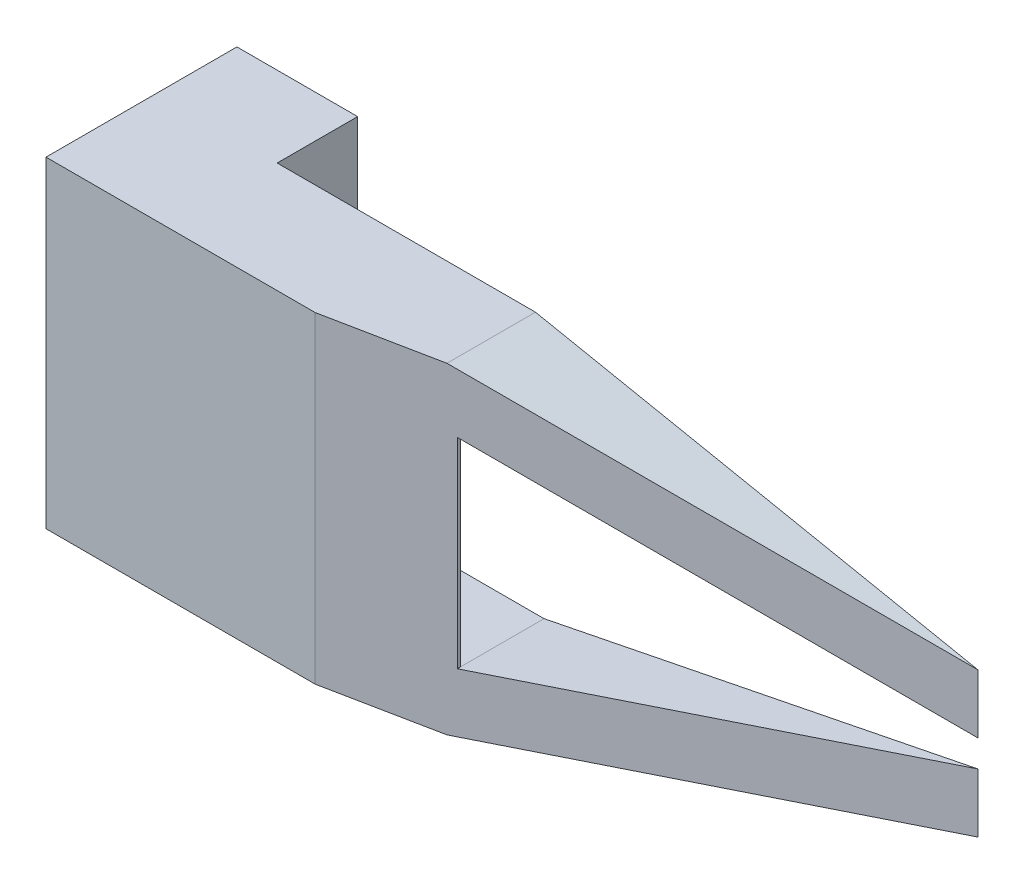
ISO-10303-21;
HEADER;
FILE_DESCRIPTION(('STEP AP214'),'2;1');
FILE_NAME('part.step','',(''),(''),'','','');
FILE_SCHEMA(('AUTOMOTIVE_DESIGN { 1 0 10303 214 1 1 1 1 }'));
ENDSEC;
DATA;
#1=APPLICATION_CONTEXT('core data for automotive mechanical design processes');
#2=APPLICATION_PROTOCOL_DEFINITION('international standard','automotive_design',2000,#1);
#3=PRODUCT_CONTEXT('',#1,'mechanical');
#4=PRODUCT('Part','Part','',(#3));
#5=PRODUCT_RELATED_PRODUCT_CATEGORY('part','',(#4));
#6=PRODUCT_DEFINITION_FORMATION('','',#4);
#7=PRODUCT_DEFINITION_CONTEXT('part definition',#1,'design');
#8=PRODUCT_DEFINITION('design','',#6,#7);
#9=PRODUCT_DEFINITION_SHAPE('','',#8);
#10=(LENGTH_UNIT() NAMED_UNIT(*) SI_UNIT(.MILLI.,.METRE.));
#11=(NAMED_UNIT(*) PLANE_ANGLE_UNIT() SI_UNIT($,.RADIAN.));
#12=(NAMED_UNIT(*) SI_UNIT($,.STERADIAN.) SOLID_ANGLE_UNIT());
#13=UNCERTAINTY_MEASURE_WITH_UNIT(LENGTH_MEASURE(1.E-05),#10,'distance_accuracy_value','');
#14=(GEOMETRIC_REPRESENTATION_CONTEXT(3) GLOBAL_UNCERTAINTY_ASSIGNED_CONTEXT((#13)) GLOBAL_UNIT_ASSIGNED_CONTEXT((#10,
#11,#12)) REPRESENTATION_CONTEXT('',''));
#15=CARTESIAN_POINT('',(0.,0.,0.));
#16=DIRECTION('',(0.,0.,1.));
#17=DIRECTION('',(1.,0.,0.));
#18=AXIS2_PLACEMENT_3D('',#15,#16,#17);
#19=CARTESIAN_POINT('',(8.78638743275149,12.,-5.88348405208144));
#20=DIRECTION('',(0.,0.,1.));
#21=DIRECTION('',(1.,0.,0.));
#22=AXIS2_PLACEMENT_3D('',#19,#20,#21);
#23=PLANE('',#22);
#24=DIRECTION('',(0.980580675688886,-0.196116135148356,0.));
#25=VECTOR('',#24,1.);
#26=CARTESIAN_POINT('',(39.4174202711404,6.5,-5.88348405208144));
#27=LINE('',#26,#25);
#28=CARTESIAN_POINT('',(23.2378391220132,9.73591623,-5.88348405208144));
#29=VERTEX_POINT('',#28);
#30=CARTESIAN_POINT('',(39.4174202711404,6.5,-5.88348405208144));
#31=VERTEX_POINT('',#30);
#32=EDGE_CURVE('E184',#29,#31,#27,.T.);
#33=ORIENTED_EDGE('',*,*,#32,.F.);
#34=DIRECTION('',(-1.,0.,0.));
#35=VECTOR('',#34,1.);
#36=CARTESIAN_POINT('',(8.78638743275149,9.73591623,-5.88348405208144));
#37=LINE('',#36,#35);
#38=CARTESIAN_POINT('',(13.28638743,9.73591623,-5.88348405208144));
#39=VERTEX_POINT('',#38);
#40=EDGE_CURVE('E281',#29,#39,#37,.T.);
#41=ORIENTED_EDGE('',*,*,#40,.T.);
#42=DIRECTION('',(0.,-1.,0.));
#43=VECTOR('',#42,1.);
#44=CARTESIAN_POINT('',(13.28638743,12.,-5.88348405208144));
#45=LINE('',#44,#43);
#46=CARTESIAN_POINT('',(13.28638743,12.,-5.88348405208144));
#47=VERTEX_POINT('',#46);
#48=EDGE_CURVE('E219',#47,#39,#45,.T.);
#49=ORIENTED_EDGE('',*,*,#48,.F.);
#50=DIRECTION('',(-1.,0.,0.));
#51=VECTOR('',#50,1.);
#52=CARTESIAN_POINT('',(8.78638743275149,12.,-5.88348405208144));
#53=LINE('',#52,#51);
#54=CARTESIAN_POINT('',(22.9174202711404,12.,-5.88348405208144));
#55=VERTEX_POINT('',#54);
#56=EDGE_CURVE('E206',#55,#47,#53,.T.);
#57=ORIENTED_EDGE('',*,*,#56,.F.);
#58=DIRECTION('',(0.980580675704681,-0.196116135069382,0.));
#59=VECTOR('',#58,1.);
#60=CARTESIAN_POINT('',(39.4174202711404,8.70000000120403,-5.88348405208144));
#61=LINE('',#60,#59);
#62=CARTESIAN_POINT('',(39.4174202711404,8.70000000120403,-5.88348405208144));
#63=VERTEX_POINT('',#62);
#64=EDGE_CURVE('E232',#55,#63,#61,.T.);
#65=ORIENTED_EDGE('',*,*,#64,.T.);
#66=DIRECTION('',(0.,-1.,0.));
#67=VECTOR('',#66,1.);
#68=CARTESIAN_POINT('',(39.4174202711404,12.,-5.88348405208144));
#69=LINE('',#68,#67);
#70=EDGE_CURVE('E303',#63,#31,#69,.T.);
#71=ORIENTED_EDGE('',*,*,#70,.T.);
#72=EDGE_LOOP('',(#33,#41,#49,#57,#65,#71));
#73=FACE_BOUND('',#72,.T.);
#74=ADVANCED_FACE('F34',(#73),#23,.F.);
#75=CARTESIAN_POINT('',(13.28638743,2.26408377,-5.88348405208144));
#76=VERTEX_POINT('',#75);
#77=CARTESIAN_POINT('',(13.28638743,0.,-5.88348405208144));
#78=VERTEX_POINT('',#77);
#79=EDGE_CURVE('E224',#76,#78,#45,.T.);
#80=ORIENTED_EDGE('',*,*,#79,.F.);
#81=DIRECTION('',(1.,0.,0.));
#82=VECTOR('',#81,1.);
#83=CARTESIAN_POINT('',(8.78638743275149,2.26408377,-5.88348405208144));
#84=LINE('',#83,#82);
#85=CARTESIAN_POINT('',(23.2378391220132,2.26408377,-5.88348405208144));
#86=VERTEX_POINT('',#85);
#87=EDGE_CURVE('E252',#76,#86,#84,.T.);
#88=ORIENTED_EDGE('',*,*,#87,.T.);
#89=DIRECTION('',(-0.980580675688886,-0.196116135148356,0.));
#90=VECTOR('',#89,1.);
#91=CARTESIAN_POINT('',(39.4174202711404,5.5,-5.88348405208144));
#92=LINE('',#91,#90);
#93=CARTESIAN_POINT('',(39.4174202711404,5.5,-5.88348405208144));
#94=VERTEX_POINT('',#93);
#95=EDGE_CURVE('E177',#94,#86,#92,.T.);
#96=ORIENTED_EDGE('',*,*,#95,.F.);
#97=CARTESIAN_POINT('',(39.4174202711404,3.29999999879597,-5.88348405208144));
#98=VERTEX_POINT('',#97);
#99=EDGE_CURVE('E308',#94,#98,#69,.T.);
#100=ORIENTED_EDGE('',*,*,#99,.T.);
#101=DIRECTION('',(0.980580675704681,0.196116135069382,0.));
#102=VECTOR('',#101,1.);
#103=CARTESIAN_POINT('',(39.4174202711404,3.29999999879597,-5.88348405208144));
#104=LINE('',#103,#102);
#105=CARTESIAN_POINT('',(22.9174202711404,0.,-5.88348405208144));
#106=VERTEX_POINT('',#105);
#107=EDGE_CURVE('E196',#106,#98,#104,.T.);
#108=ORIENTED_EDGE('',*,*,#107,.F.);
#109=DIRECTION('',(-1.,0.,0.));
#110=VECTOR('',#109,1.);
#111=CARTESIAN_POINT('',(8.78638743275149,0.,-5.88348405208144));
#112=LINE('',#111,#110);
#113=EDGE_CURVE('E216',#106,#78,#112,.T.);
#114=ORIENTED_EDGE('',*,*,#113,.T.);
#115=EDGE_LOOP('',(#80,#88,#96,#100,#108,#114));
#116=FACE_BOUND('',#115,.T.);
#117=ADVANCED_FACE('F251',(#116),#23,.F.);
#118=CARTESIAN_POINT('',(20.7863874327515,12.,-2.1572774857632));
#119=DIRECTION('',(-0.196116135069381,0.,-0.980580675704681));
#120=DIRECTION('',(-0.980580675704681,0.,0.196116135069381));
#121=AXIS2_PLACEMENT_3D('',#118,#119,#120);
#122=PLANE('',#121);
#123=DIRECTION('',(0.962250448675383,-0.19245008966486,-0.192450089664859));
#124=VECTOR('',#123,1.);
#125=CARTESIAN_POINT('',(20.8653145748607,12.4104211391062,-2.17306291417929));
#126=LINE('',#125,#124);
#127=CARTESIAN_POINT('',(22.9174202711404,12.,-2.58348405328548));
#128=VERTEX_POINT('',#127);
#129=EDGE_CURVE('E328',#128,#63,#126,.T.);
#130=ORIENTED_EDGE('',*,*,#129,.F.);
#131=DIRECTION('',(0.980580675704681,0.,-0.196116135069381));
#132=VECTOR('',#131,1.);
#133=CARTESIAN_POINT('',(20.7863874327515,12.,-2.1572774857632));
#134=LINE('',#133,#132);
#135=CARTESIAN_POINT('',(18.8252260813421,12.,-1.76504521562444));
#136=VERTEX_POINT('',#135);
#137=EDGE_CURVE('E203',#136,#128,#134,.T.);
#138=ORIENTED_EDGE('',*,*,#137,.F.);
#139=DIRECTION('',(0.,1.,0.));
#140=VECTOR('',#139,1.);
#141=CARTESIAN_POINT('',(18.8252260813421,0.,-1.76504521562444));
#142=LINE('',#141,#140);
#143=CARTESIAN_POINT('',(18.8252260813421,0.,-1.76504521562444));
#144=VERTEX_POINT('',#143);
#145=EDGE_CURVE('E238',#144,#136,#142,.T.);
#146=ORIENTED_EDGE('',*,*,#145,.F.);
#147=DIRECTION('',(0.980580675704681,0.,-0.196116135069381));
#148=VECTOR('',#147,1.);
#149=CARTESIAN_POINT('',(20.7863874327515,0.,-2.1572774857632));
#150=LINE('',#149,#148);
#151=CARTESIAN_POINT('',(22.9174202711404,0.,-2.58348405328548));
#152=VERTEX_POINT('',#151);
#153=EDGE_CURVE('E202',#144,#152,#150,.T.);
#154=ORIENTED_EDGE('',*,*,#153,.T.);
#155=DIRECTION('',(0.962250448675383,0.19245008966486,-0.192450089664859));
#156=VECTOR('',#155,1.);
#157=CARTESIAN_POINT('',(23.0875367963923,0.0340233050379526,-2.61750735832344));
#158=LINE('',#157,#156);
#159=EDGE_CURVE('E199',#152,#98,#158,.T.);
#160=ORIENTED_EDGE('',*,*,#159,.T.);
#161=ORIENTED_EDGE('',*,*,#99,.F.);
#162=DIRECTION('',(-0.962250448660457,-0.192450089742473,0.192450089661874));
#163=VECTOR('',#162,1.);
#164=CARTESIAN_POINT('',(22.6801293899119,2.15254182357371,-2.53602587705708));
#165=LINE('',#164,#163);
#166=CARTESIAN_POINT('',(23.2378391220132,2.26408377,-2.64756782343665));
#167=VERTEX_POINT('',#166);
#168=EDGE_CURVE('E186',#94,#167,#165,.T.);
#169=ORIENTED_EDGE('',*,*,#168,.T.);
#170=DIRECTION('',(0.,1.,0.));
#171=VECTOR('',#170,1.);
#172=CARTESIAN_POINT('',(23.2378391220132,12.,-2.64756782343665));
#173=LINE('',#172,#171);
#174=CARTESIAN_POINT('',(23.2378391220132,9.73591623,-2.64756782343665));
#175=VERTEX_POINT('',#174);
#176=EDGE_CURVE('E182',#167,#175,#173,.T.);
#177=ORIENTED_EDGE('',*,*,#176,.T.);
#178=DIRECTION('',(0.962250448660457,-0.192450089742473,-0.192450089661874));
#179=VECTOR('',#178,1.);
#180=CARTESIAN_POINT('',(20.4579071675186,10.2919026209289,-2.09158143274059));
#181=LINE('',#180,#179);
#182=EDGE_CURVE('E193',#175,#31,#181,.T.);
#183=ORIENTED_EDGE('',*,*,#182,.T.);
#184=ORIENTED_EDGE('',*,*,#70,.F.);
#185=EDGE_LOOP('',(#130,#138,#146,#154,#160,#161,#169,#177,#183,#184));
#186=FACE_BOUND('',#185,.T.);
#187=ADVANCED_FACE('F36',(#186),#122,.F.);
#188=CARTESIAN_POINT('',(0.,12.,0.));
#189=DIRECTION('',(0.,1.,0.));
#190=DIRECTION('',(0.,0.,1.));
#191=AXIS2_PLACEMENT_3D('',#188,#189,#190);
#192=PLANE('',#191);
#193=ORIENTED_EDGE('',*,*,#137,.T.);
#194=DIRECTION('',(0.,0.,-1.));
#195=VECTOR('',#194,1.);
#196=CARTESIAN_POINT('',(22.9174202711404,12.,0.));
#197=LINE('',#196,#195);
#198=EDGE_CURVE('E243',#128,#55,#197,.T.);
#199=ORIENTED_EDGE('',*,*,#198,.T.);
#200=ORIENTED_EDGE('',*,*,#56,.T.);
#201=DIRECTION('',(0.,0.,1.));
#202=VECTOR('',#201,1.);
#203=CARTESIAN_POINT('',(13.28638743,12.,-8.88348405208144));
#204=LINE('',#203,#202);
#205=CARTESIAN_POINT('',(13.28638743,12.,-8.88348405208144));
#206=VERTEX_POINT('',#205);
#207=EDGE_CURVE('E262',#206,#47,#204,.T.);
#208=ORIENTED_EDGE('',*,*,#207,.F.);
#209=DIRECTION('',(1.,0.,0.));
#210=VECTOR('',#209,1.);
#211=CARTESIAN_POINT('',(8.78638743,12.,-8.88348405208144));
#212=LINE('',#211,#210);
#213=CARTESIAN_POINT('',(8.78638743,12.,-8.88348405208144));
#214=VERTEX_POINT('',#213);
#215=EDGE_CURVE('E268',#214,#206,#212,.T.);
#216=ORIENTED_EDGE('',*,*,#215,.F.);
#217=DIRECTION('',(0.,0.,1.));
#218=VECTOR('',#217,1.);
#219=CARTESIAN_POINT('',(8.78638743275149,12.,-2.1572774857632));
#220=LINE('',#219,#218);
#221=CARTESIAN_POINT('',(8.78638743275149,12.,-1.76504521562444));
#222=VERTEX_POINT('',#221);
#223=EDGE_CURVE('E210',#214,#222,#220,.T.);
#224=ORIENTED_EDGE('',*,*,#223,.T.);
#225=DIRECTION('',(1.,0.,0.));
#226=VECTOR('',#225,1.);
#227=CARTESIAN_POINT('',(18.8252260813421,12.,-1.76504521562444));
#228=LINE('',#227,#226);
#229=EDGE_CURVE('E278',#222,#136,#228,.T.);
#230=ORIENTED_EDGE('',*,*,#229,.T.);
#231=EDGE_LOOP('',(#193,#199,#200,#208,#216,#224,#230));
#232=FACE_BOUND('',#231,.T.);
#233=ADVANCED_FACE('F314',(#232),#192,.T.);
#234=CARTESIAN_POINT('',(8.78638743275149,12.,-2.1572774857632));
#235=DIRECTION('',(1.,0.,0.));
#236=DIRECTION('',(0.,0.,-1.));
#237=AXIS2_PLACEMENT_3D('',#234,#235,#236);
#238=PLANE('',#237);
#239=DIRECTION('',(0.,-1.,0.));
#240=VECTOR('',#239,1.);
#241=CARTESIAN_POINT('',(8.78638743275149,9.73591623,-6.44348405562444));
#242=LINE('',#241,#240);
#243=CARTESIAN_POINT('',(8.78638743275149,9.73591623,-6.44348405562444));
#244=VERTEX_POINT('',#243);
#245=CARTESIAN_POINT('',(8.78638743275149,2.26408377,-6.44348405562444));
#246=VERTEX_POINT('',#245);
#247=EDGE_CURVE('E293',#244,#246,#242,.T.);
#248=ORIENTED_EDGE('',*,*,#247,.F.);
#249=DIRECTION('',(0.,0.,-1.));
#250=VECTOR('',#249,1.);
#251=CARTESIAN_POINT('',(8.78638743275149,9.73591623,-2.76504521562444));
#252=LINE('',#251,#250);
#253=CARTESIAN_POINT('',(8.78638743275149,9.73591623,-2.76504521562444));
#254=VERTEX_POINT('',#253);
#255=EDGE_CURVE('E49',#254,#244,#252,.T.);
#256=ORIENTED_EDGE('',*,*,#255,.F.);
#257=DIRECTION('',(0.,1.,0.));
#258=VECTOR('',#257,1.);
#259=CARTESIAN_POINT('',(8.78638743275149,2.26408377,-2.76504521562444));
#260=LINE('',#259,#258);
#261=CARTESIAN_POINT('',(8.78638743275149,2.26408377,-2.76504521562444));
#262=VERTEX_POINT('',#261);
#263=EDGE_CURVE('E290',#262,#254,#260,.T.);
#264=ORIENTED_EDGE('',*,*,#263,.F.);
#265=DIRECTION('',(0.,0.,1.));
#266=VECTOR('',#265,1.);
#267=CARTESIAN_POINT('',(8.78638743275149,2.26408377,-2.76504521562444));
#268=LINE('',#267,#266);
#269=EDGE_CURVE('E154',#246,#262,#268,.T.);
#270=ORIENTED_EDGE('',*,*,#269,.F.);
#271=EDGE_LOOP('',(#248,#256,#264,#270));
#272=FACE_BOUND('',#271,.T.);
#273=DIRECTION('',(0.,0.,1.));
#274=VECTOR('',#273,1.);
#275=CARTESIAN_POINT('',(8.78638743275149,0.,-2.1572774857632));
#276=LINE('',#275,#274);
#277=CARTESIAN_POINT('',(8.78638743,0.,-8.88348405208144));
#278=VERTEX_POINT('',#277);
#279=CARTESIAN_POINT('',(8.78638743275149,0.,-1.76504521562444));
#280=VERTEX_POINT('',#279);
#281=EDGE_CURVE('E207',#278,#280,#276,.T.);
#282=ORIENTED_EDGE('',*,*,#281,.T.);
#283=DIRECTION('',(0.,1.,0.));
#284=VECTOR('',#283,1.);
#285=CARTESIAN_POINT('',(8.78638743275149,0.,-1.76504521562444));
#286=LINE('',#285,#284);
#287=EDGE_CURVE('E272',#280,#222,#286,.T.);
#288=ORIENTED_EDGE('',*,*,#287,.T.);
#289=ORIENTED_EDGE('',*,*,#223,.F.);
#290=DIRECTION('',(0.,1.,0.));
#291=VECTOR('',#290,1.);
#292=CARTESIAN_POINT('',(8.78638743,12.,-8.88348405208144));
#293=LINE('',#292,#291);
#294=EDGE_CURVE('E223',#278,#214,#293,.T.);
#295=ORIENTED_EDGE('',*,*,#294,.F.);
#296=EDGE_LOOP('',(#282,#288,#289,#295));
#297=FACE_BOUND('',#296,.T.);
#298=ADVANCED_FACE('F320',(#272,#297),#238,.F.);
#299=CARTESIAN_POINT('',(0.,0.,0.));
#300=DIRECTION('',(0.,1.,0.));
#301=DIRECTION('',(0.,0.,1.));
#302=AXIS2_PLACEMENT_3D('',#299,#300,#301);
#303=PLANE('',#302);
#304=ORIENTED_EDGE('',*,*,#113,.F.);
#305=DIRECTION('',(0.,0.,1.));
#306=VECTOR('',#305,1.);
#307=CARTESIAN_POINT('',(22.9174202711404,0.,0.));
#308=LINE('',#307,#306);
#309=EDGE_CURVE('E307',#106,#152,#308,.T.);
#310=ORIENTED_EDGE('',*,*,#309,.T.);
#311=ORIENTED_EDGE('',*,*,#153,.F.);
#312=DIRECTION('',(1.,0.,0.));
#313=VECTOR('',#312,1.);
#314=CARTESIAN_POINT('',(18.8252260813421,0.,-1.76504521562444));
#315=LINE('',#314,#313);
#316=EDGE_CURVE('E275',#280,#144,#315,.T.);
#317=ORIENTED_EDGE('',*,*,#316,.F.);
#318=ORIENTED_EDGE('',*,*,#281,.F.);
#319=DIRECTION('',(-1.,0.,0.));
#320=VECTOR('',#319,1.);
#321=CARTESIAN_POINT('',(13.28638743,0.,-8.88348405208144));
#322=LINE('',#321,#320);
#323=CARTESIAN_POINT('',(13.28638743,0.,-8.88348405208144));
#324=VERTEX_POINT('',#323);
#325=EDGE_CURVE('E230',#324,#278,#322,.T.);
#326=ORIENTED_EDGE('',*,*,#325,.F.);
#327=DIRECTION('',(0.,0.,1.));
#328=VECTOR('',#327,1.);
#329=CARTESIAN_POINT('',(13.28638743,0.,-8.88348405208144));
#330=LINE('',#329,#328);
#331=EDGE_CURVE('E225',#324,#78,#330,.T.);
#332=ORIENTED_EDGE('',*,*,#331,.T.);
#333=EDGE_LOOP('',(#304,#310,#311,#317,#318,#326,#332));
#334=FACE_BOUND('',#333,.T.);
#335=ADVANCED_FACE('F259',(#334),#303,.F.);
#336=CARTESIAN_POINT('',(39.4174202711404,3.29999999879597,2.11651594791856));
#337=DIRECTION('',(-0.196116135069382,0.980580675704681,0.));
#338=DIRECTION('',(-0.980580675704681,-0.196116135069382,0.));
#339=AXIS2_PLACEMENT_3D('',#336,#337,#338);
#340=PLANE('',#339);
#341=ORIENTED_EDGE('',*,*,#309,.F.);
#342=ORIENTED_EDGE('',*,*,#107,.T.);
#343=ORIENTED_EDGE('',*,*,#159,.F.);
#344=EDGE_LOOP('',(#341,#342,#343));
#345=FACE_BOUND('',#344,.T.);
#346=ADVANCED_FACE('F350',(#345),#340,.F.);
#347=CARTESIAN_POINT('',(39.4174202711404,6.5,2.11651594791856));
#348=DIRECTION('',(0.196116135148356,0.980580675688886,0.));
#349=DIRECTION('',(-0.980580675688886,0.196116135148356,0.));
#350=AXIS2_PLACEMENT_3D('',#347,#348,#349);
#351=PLANE('',#350);
#352=DIRECTION('',(0.,0.,-1.));
#353=VECTOR('',#352,1.);
#354=CARTESIAN_POINT('',(23.2378391220132,9.73591623,2.11651594791856));
#355=LINE('',#354,#353);
#356=CARTESIAN_POINT('',(23.2378391220132,9.73591623,-2.76504521562444));
#357=VERTEX_POINT('',#356);
#358=EDGE_CURVE('E183',#175,#357,#355,.T.);
#359=ORIENTED_EDGE('',*,*,#358,.T.);
#360=DIRECTION('',(0.,0.,-1.));
#361=VECTOR('',#360,1.);
#362=CARTESIAN_POINT('',(23.2378391220132,9.73591623,-2.76504521562444));
#363=LINE('',#362,#361);
#364=EDGE_CURVE('E178',#357,#29,#363,.T.);
#365=ORIENTED_EDGE('',*,*,#364,.T.);
#366=ORIENTED_EDGE('',*,*,#32,.T.);
#367=ORIENTED_EDGE('',*,*,#182,.F.);
#368=EDGE_LOOP('',(#359,#365,#366,#367));
#369=FACE_BOUND('',#368,.T.);
#370=ADVANCED_FACE('F299',(#369),#351,.F.);
#371=CARTESIAN_POINT('',(23.2378391220132,2.26408377,2.11651594791856));
#372=DIRECTION('',(-1.,0.,0.));
#373=DIRECTION('',(0.,-1.,0.));
#374=AXIS2_PLACEMENT_3D('',#371,#372,#373);
#375=PLANE('',#374);
#376=DIRECTION('',(0.,0.,-1.));
#377=VECTOR('',#376,1.);
#378=CARTESIAN_POINT('',(23.2378391220132,2.26408377,2.11651594791856));
#379=LINE('',#378,#377);
#380=CARTESIAN_POINT('',(23.2378391220132,2.26408377,-2.76504521562444));
#381=VERTEX_POINT('',#380);
#382=EDGE_CURVE('E174',#167,#381,#379,.T.);
#383=ORIENTED_EDGE('',*,*,#382,.T.);
#384=DIRECTION('',(0.,1.,0.));
#385=VECTOR('',#384,1.);
#386=CARTESIAN_POINT('',(23.2378391220132,2.26408377,-2.76504521562444));
#387=LINE('',#386,#385);
#388=EDGE_CURVE('E161',#381,#357,#387,.T.);
#389=ORIENTED_EDGE('',*,*,#388,.T.);
#390=ORIENTED_EDGE('',*,*,#358,.F.);
#391=ORIENTED_EDGE('',*,*,#176,.F.);
#392=EDGE_LOOP('',(#383,#389,#390,#391));
#393=FACE_BOUND('',#392,.T.);
#394=ADVANCED_FACE('F180',(#393),#375,.F.);
#395=CARTESIAN_POINT('',(39.4174202711404,5.5,2.11651594791856));
#396=DIRECTION('',(0.196116135148356,-0.980580675688886,0.));
#397=DIRECTION('',(0.980580675688886,0.196116135148356,0.));
#398=AXIS2_PLACEMENT_3D('',#395,#396,#397);
#399=PLANE('',#398);
#400=ORIENTED_EDGE('',*,*,#95,.T.);
#401=DIRECTION('',(0.,0.,1.));
#402=VECTOR('',#401,1.);
#403=CARTESIAN_POINT('',(23.2378391220132,2.26408377,-2.76504521562444));
#404=LINE('',#403,#402);
#405=EDGE_CURVE('E151',#86,#381,#404,.T.);
#406=ORIENTED_EDGE('',*,*,#405,.T.);
#407=ORIENTED_EDGE('',*,*,#382,.F.);
#408=ORIENTED_EDGE('',*,*,#168,.F.);
#409=EDGE_LOOP('',(#400,#406,#407,#408));
#410=FACE_BOUND('',#409,.T.);
#411=ADVANCED_FACE('F173',(#410),#399,.F.);
#412=CARTESIAN_POINT('',(39.4174202711404,8.70000000120403,2.11651594791856));
#413=DIRECTION('',(0.196116135069382,0.980580675704681,0.));
#414=DIRECTION('',(-0.980580675704681,0.196116135069382,0.));
#415=AXIS2_PLACEMENT_3D('',#412,#413,#414);
#416=PLANE('',#415);
#417=ORIENTED_EDGE('',*,*,#129,.T.);
#418=ORIENTED_EDGE('',*,*,#64,.F.);
#419=ORIENTED_EDGE('',*,*,#198,.F.);
#420=EDGE_LOOP('',(#417,#418,#419));
#421=FACE_BOUND('',#420,.T.);
#422=ADVANCED_FACE('F330',(#421),#416,.T.);
#423=CARTESIAN_POINT('',(13.28638743,12.,-8.88348405208144));
#424=DIRECTION('',(-1.,0.,0.));
#425=DIRECTION('',(0.,0.,1.));
#426=AXIS2_PLACEMENT_3D('',#423,#424,#425);
#427=PLANE('',#426);
#428=ORIENTED_EDGE('',*,*,#48,.T.);
#429=DIRECTION('',(0.,0.,-1.));
#430=VECTOR('',#429,1.);
#431=CARTESIAN_POINT('',(13.28638743,9.73591623,-8.88348405208144));
#432=LINE('',#431,#430);
#433=CARTESIAN_POINT('',(13.28638743,9.73591623,-6.44348405562444));
#434=VERTEX_POINT('',#433);
#435=EDGE_CURVE('E11',#39,#434,#432,.T.);
#436=ORIENTED_EDGE('',*,*,#435,.T.);
#437=DIRECTION('',(0.,-1.,0.));
#438=VECTOR('',#437,1.);
#439=CARTESIAN_POINT('',(13.28638743,12.,-6.44348405562444));
#440=LINE('',#439,#438);
#441=CARTESIAN_POINT('',(13.28638743,2.26408377,-6.44348405562444));
#442=VERTEX_POINT('',#441);
#443=EDGE_CURVE('E241',#434,#442,#440,.T.);
#444=ORIENTED_EDGE('',*,*,#443,.T.);
#445=DIRECTION('',(0.,0.,1.));
#446=VECTOR('',#445,1.);
#447=CARTESIAN_POINT('',(13.28638743,2.26408377,-8.88348405208144));
#448=LINE('',#447,#446);
#449=EDGE_CURVE('E42',#442,#76,#448,.T.);
#450=ORIENTED_EDGE('',*,*,#449,.T.);
#451=ORIENTED_EDGE('',*,*,#79,.T.);
#452=ORIENTED_EDGE('',*,*,#331,.F.);
#453=DIRECTION('',(0.,-1.,0.));
#454=VECTOR('',#453,1.);
#455=CARTESIAN_POINT('',(13.28638743,12.,-8.88348405208144));
#456=LINE('',#455,#454);
#457=EDGE_CURVE('E264',#206,#324,#456,.T.);
#458=ORIENTED_EDGE('',*,*,#457,.F.);
#459=ORIENTED_EDGE('',*,*,#207,.T.);
#460=EDGE_LOOP('',(#428,#436,#444,#450,#451,#452,#458,#459));
#461=FACE_BOUND('',#460,.T.);
#462=ADVANCED_FACE('F247',(#461),#427,.F.);
#463=CARTESIAN_POINT('',(0.,0.,-8.88348405208144));
#464=DIRECTION('',(0.,0.,-1.));
#465=DIRECTION('',(-1.,0.,0.));
#466=AXIS2_PLACEMENT_3D('',#463,#464,#465);
#467=PLANE('',#466);
#468=ORIENTED_EDGE('',*,*,#294,.T.);
#469=ORIENTED_EDGE('',*,*,#215,.T.);
#470=ORIENTED_EDGE('',*,*,#457,.T.);
#471=ORIENTED_EDGE('',*,*,#325,.T.);
#472=EDGE_LOOP('',(#468,#469,#470,#471));
#473=FACE_BOUND('',#472,.T.);
#474=ADVANCED_FACE('F318',(#473),#467,.T.);
#475=CARTESIAN_POINT('',(18.8252260813421,0.,-1.76504521562444));
#476=DIRECTION('',(0.,0.,1.));
#477=DIRECTION('',(1.,0.,0.));
#478=AXIS2_PLACEMENT_3D('',#475,#476,#477);
#479=PLANE('',#478);
#480=ORIENTED_EDGE('',*,*,#229,.F.);
#481=ORIENTED_EDGE('',*,*,#287,.F.);
#482=ORIENTED_EDGE('',*,*,#316,.T.);
#483=ORIENTED_EDGE('',*,*,#145,.T.);
#484=EDGE_LOOP('',(#480,#481,#482,#483));
#485=FACE_BOUND('',#484,.T.);
#486=ADVANCED_FACE('F325',(#485),#479,.T.);
#487=CARTESIAN_POINT('',(23.2378391220132,9.73591623,-2.76504521562444));
#488=DIRECTION('',(0.,1.,0.));
#489=DIRECTION('',(0.,0.,1.));
#490=AXIS2_PLACEMENT_3D('',#487,#488,#489);
#491=PLANE('',#490);
#492=ORIENTED_EDGE('',*,*,#364,.F.);
#493=DIRECTION('',(-1.,0.,0.));
#494=VECTOR('',#493,1.);
#495=CARTESIAN_POINT('',(23.2378391220132,9.73591623,-2.76504521562444));
#496=LINE('',#495,#494);
#497=EDGE_CURVE('E158',#357,#254,#496,.T.);
#498=ORIENTED_EDGE('',*,*,#497,.T.);
#499=ORIENTED_EDGE('',*,*,#255,.T.);
#500=DIRECTION('',(-1.,0.,0.));
#501=VECTOR('',#500,1.);
#502=CARTESIAN_POINT('',(23.2378391220132,9.73591623,-6.44348405562444));
#503=LINE('',#502,#501);
#504=EDGE_CURVE('E168',#434,#244,#503,.T.);
#505=ORIENTED_EDGE('',*,*,#504,.F.);
#506=ORIENTED_EDGE('',*,*,#435,.F.);
#507=ORIENTED_EDGE('',*,*,#40,.F.);
#508=EDGE_LOOP('',(#492,#498,#499,#505,#506,#507));
#509=FACE_BOUND('',#508,.T.);
#510=ADVANCED_FACE('F386',(#509),#491,.F.);
#511=CARTESIAN_POINT('',(23.2378391220132,2.26408377,-2.76504521562444));
#512=DIRECTION('',(0.,-1.,0.));
#513=DIRECTION('',(0.,0.,-1.));
#514=AXIS2_PLACEMENT_3D('',#511,#512,#513);
#515=PLANE('',#514);
#516=ORIENTED_EDGE('',*,*,#449,.F.);
#517=DIRECTION('',(-1.,0.,0.));
#518=VECTOR('',#517,1.);
#519=CARTESIAN_POINT('',(23.2378391220132,2.26408377,-6.44348405562444));
#520=LINE('',#519,#518);
#521=EDGE_CURVE('E57',#442,#246,#520,.T.);
#522=ORIENTED_EDGE('',*,*,#521,.T.);
#523=ORIENTED_EDGE('',*,*,#269,.T.);
#524=DIRECTION('',(-1.,0.,0.));
#525=VECTOR('',#524,1.);
#526=CARTESIAN_POINT('',(23.2378391220132,2.26408377,-2.76504521562444));
#527=LINE('',#526,#525);
#528=EDGE_CURVE('E147',#381,#262,#527,.T.);
#529=ORIENTED_EDGE('',*,*,#528,.F.);
#530=ORIENTED_EDGE('',*,*,#405,.F.);
#531=ORIENTED_EDGE('',*,*,#87,.F.);
#532=EDGE_LOOP('',(#516,#522,#523,#529,#530,#531));
#533=FACE_BOUND('',#532,.T.);
#534=ADVANCED_FACE('F149',(#533),#515,.F.);
#535=CARTESIAN_POINT('',(23.2378391220132,9.73591623,-6.44348405562444));
#536=DIRECTION('',(0.,0.,-1.));
#537=DIRECTION('',(-1.,0.,0.));
#538=AXIS2_PLACEMENT_3D('',#535,#536,#537);
#539=PLANE('',#538);
#540=ORIENTED_EDGE('',*,*,#504,.T.);
#541=ORIENTED_EDGE('',*,*,#247,.T.);
#542=ORIENTED_EDGE('',*,*,#521,.F.);
#543=ORIENTED_EDGE('',*,*,#443,.F.);
#544=EDGE_LOOP('',(#540,#541,#542,#543));
#545=FACE_BOUND('',#544,.T.);
#546=ADVANCED_FACE('F401',(#545),#539,.F.);
#547=CARTESIAN_POINT('',(23.2378391220132,2.26408377,-2.76504521562444));
#548=DIRECTION('',(0.,0.,1.));
#549=DIRECTION('',(1.,0.,0.));
#550=AXIS2_PLACEMENT_3D('',#547,#548,#549);
#551=PLANE('',#550);
#552=ORIENTED_EDGE('',*,*,#263,.T.);
#553=ORIENTED_EDGE('',*,*,#497,.F.);
#554=ORIENTED_EDGE('',*,*,#388,.F.);
#555=ORIENTED_EDGE('',*,*,#528,.T.);
#556=EDGE_LOOP('',(#552,#553,#554,#555));
#557=FACE_BOUND('',#556,.T.);
#558=ADVANCED_FACE('F162',(#557),#551,.F.);
#559=CLOSED_SHELL('',(#74,#117,#187,#233,#298,#335,#346,#370,#394,#411,#422,#462,#474,#486,#510,
#534,#546,#558));
#560=MANIFOLD_SOLID_BREP('B2',#559);
#561=ADVANCED_BREP_SHAPE_REPRESENTATION('',(#18,#560),#14);
#562=SHAPE_DEFINITION_REPRESENTATION(#9,#561);
ENDSEC;
END-ISO-10303-21;
